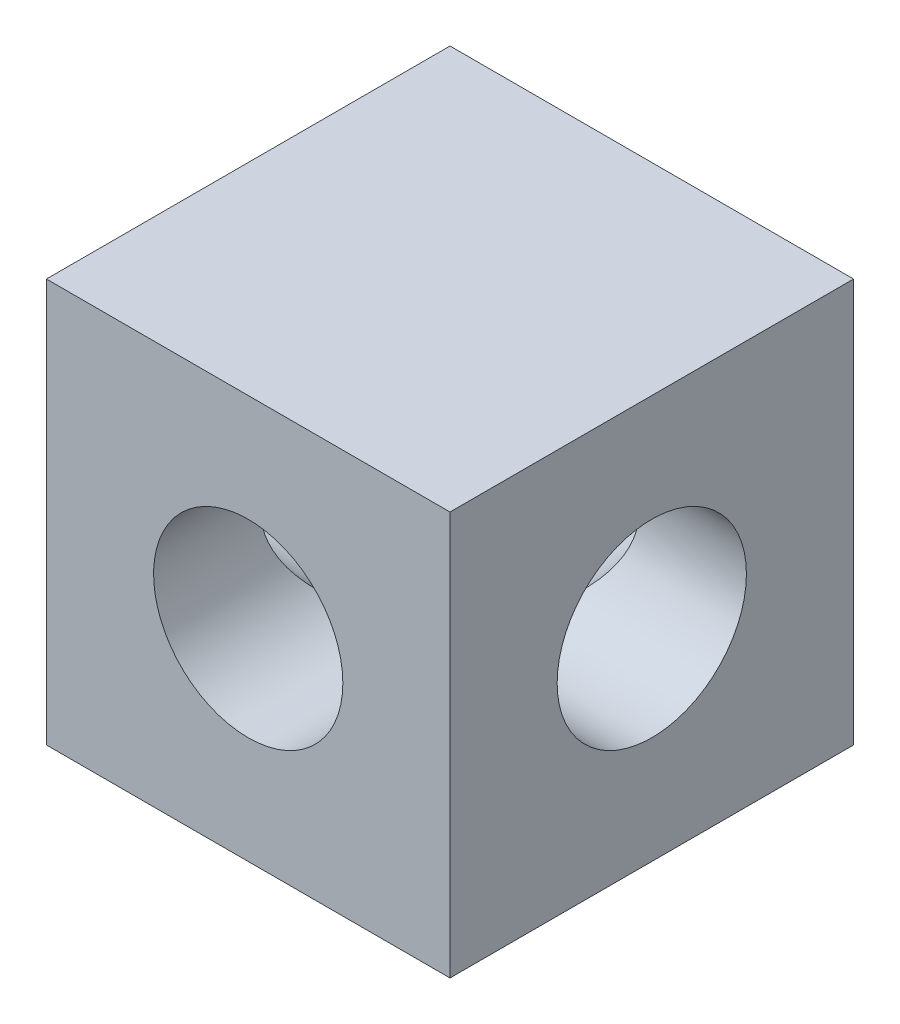
ISO-10303-21;
HEADER;
FILE_DESCRIPTION(('STEP AP214'),'2;1');
FILE_NAME('part.step','',(''),(''),'','','');
FILE_SCHEMA(('AUTOMOTIVE_DESIGN { 1 0 10303 214 1 1 1 1 }'));
ENDSEC;
DATA;
#1=APPLICATION_CONTEXT('core data for automotive mechanical design processes');
#2=APPLICATION_PROTOCOL_DEFINITION('international standard','automotive_design',2000,#1);
#3=PRODUCT_CONTEXT('',#1,'mechanical');
#4=PRODUCT('Part','Part','',(#3));
#5=PRODUCT_RELATED_PRODUCT_CATEGORY('part','',(#4));
#6=PRODUCT_DEFINITION_FORMATION('','',#4);
#7=PRODUCT_DEFINITION_CONTEXT('part definition',#1,'design');
#8=PRODUCT_DEFINITION('design','',#6,#7);
#9=PRODUCT_DEFINITION_SHAPE('','',#8);
#10=(LENGTH_UNIT() NAMED_UNIT(*) SI_UNIT(.MILLI.,.METRE.));
#11=(NAMED_UNIT(*) PLANE_ANGLE_UNIT() SI_UNIT($,.RADIAN.));
#12=(NAMED_UNIT(*) SI_UNIT($,.STERADIAN.) SOLID_ANGLE_UNIT());
#13=UNCERTAINTY_MEASURE_WITH_UNIT(LENGTH_MEASURE(1.E-05),#10,'distance_accuracy_value','');
#14=(GEOMETRIC_REPRESENTATION_CONTEXT(3) GLOBAL_UNCERTAINTY_ASSIGNED_CONTEXT((#13)) GLOBAL_UNIT_ASSIGNED_CONTEXT((#10,
#11,#12)) REPRESENTATION_CONTEXT('',''));
#15=CARTESIAN_POINT('',(0.,0.,0.));
#16=DIRECTION('',(0.,0.,1.));
#17=DIRECTION('',(1.,0.,0.));
#18=AXIS2_PLACEMENT_3D('',#15,#16,#17);
#19=CARTESIAN_POINT('',(0.,0.,20.32));
#20=DIRECTION('',(0.,0.,-1.));
#21=DIRECTION('',(-1.,0.,0.));
#22=AXIS2_PLACEMENT_3D('',#19,#20,#21);
#23=CYLINDRICAL_SURFACE('',#22,4.765);
#24=CARTESIAN_POINT('',(0.,0.,10.16));
#25=DIRECTION('',(0.707106781186547,0.,-0.707106781186547));
#26=DIRECTION('',(-0.707106781186547,0.,-0.707106781186547));
#27=AXIS2_PLACEMENT_3D('',#24,#25,#26);
#28=ELLIPSE('',#27,6.7387276247078,4.765);
#29=CARTESIAN_POINT('',(0.,-4.765,10.16));
#30=VERTEX_POINT('',#29);
#31=CARTESIAN_POINT('',(0.,4.765,10.16));
#32=VERTEX_POINT('',#31);
#33=EDGE_CURVE('E11',#30,#32,#28,.F.);
#34=ORIENTED_EDGE('',*,*,#33,.F.);
#35=CARTESIAN_POINT('',(0.,0.,10.16));
#36=DIRECTION('',(-0.707106781186547,0.,-0.707106781186547));
#37=DIRECTION('',(0.707106781186547,0.,-0.707106781186547));
#38=AXIS2_PLACEMENT_3D('',#35,#36,#37);
#39=ELLIPSE('',#38,6.7387276247078,4.765);
#40=EDGE_CURVE('E54',#32,#30,#39,.F.);
#41=ORIENTED_EDGE('',*,*,#40,.F.);
#42=EDGE_LOOP('',(#34,#41));
#43=FACE_BOUND('',#42,.T.);
#44=CARTESIAN_POINT('',(0.,0.,20.32));
#45=DIRECTION('',(0.,0.,1.));
#46=DIRECTION('',(1.,0.,0.));
#47=AXIS2_PLACEMENT_3D('',#44,#45,#46);
#48=CIRCLE('',#47,4.765);
#49=CARTESIAN_POINT('',(4.765,0.,20.32));
#50=VERTEX_POINT('',#49);
#51=EDGE_CURVE('E140',#50,#50,#48,.T.);
#52=ORIENTED_EDGE('',*,*,#51,.T.);
#53=EDGE_LOOP('',(#52));
#54=FACE_BOUND('',#53,.T.);
#55=ADVANCED_FACE('F39',(#43,#54),#23,.F.);
#56=CARTESIAN_POINT('',(0.,0.,20.32));
#57=DIRECTION('',(0.,0.,-1.));
#58=DIRECTION('',(-1.,0.,0.));
#59=AXIS2_PLACEMENT_3D('',#56,#57,#58);
#60=PLANE('',#59);
#61=DIRECTION('',(0.,1.,0.));
#62=VECTOR('',#61,1.);
#63=CARTESIAN_POINT('',(10.16,-10.16,20.32));
#64=LINE('',#63,#62);
#65=CARTESIAN_POINT('',(10.16,-10.16,20.32));
#66=VERTEX_POINT('',#65);
#67=CARTESIAN_POINT('',(10.16,10.16,20.32));
#68=VERTEX_POINT('',#67);
#69=EDGE_CURVE('E129',#66,#68,#64,.T.);
#70=ORIENTED_EDGE('',*,*,#69,.T.);
#71=DIRECTION('',(-1.,0.,0.));
#72=VECTOR('',#71,1.);
#73=CARTESIAN_POINT('',(-10.16,10.16,20.32));
#74=LINE('',#73,#72);
#75=CARTESIAN_POINT('',(-10.16,10.16,20.32));
#76=VERTEX_POINT('',#75);
#77=EDGE_CURVE('E92',#68,#76,#74,.T.);
#78=ORIENTED_EDGE('',*,*,#77,.T.);
#79=DIRECTION('',(0.,-1.,0.));
#80=VECTOR('',#79,1.);
#81=CARTESIAN_POINT('',(-10.16,-10.16,20.32));
#82=LINE('',#81,#80);
#83=CARTESIAN_POINT('',(-10.16,-10.16,20.32));
#84=VERTEX_POINT('',#83);
#85=EDGE_CURVE('E143',#76,#84,#82,.T.);
#86=ORIENTED_EDGE('',*,*,#85,.T.);
#87=DIRECTION('',(1.,0.,0.));
#88=VECTOR('',#87,1.);
#89=CARTESIAN_POINT('',(-10.16,-10.16,20.32));
#90=LINE('',#89,#88);
#91=EDGE_CURVE('E63',#84,#66,#90,.T.);
#92=ORIENTED_EDGE('',*,*,#91,.T.);
#93=EDGE_LOOP('',(#70,#78,#86,#92));
#94=FACE_BOUND('',#93,.T.);
#95=ORIENTED_EDGE('',*,*,#51,.F.);
#96=EDGE_LOOP('',(#95));
#97=FACE_BOUND('',#96,.T.);
#98=ADVANCED_FACE('F185',(#94,#97),#60,.F.);
#99=CARTESIAN_POINT('',(0.,0.,0.));
#100=DIRECTION('',(0.,0.,-1.));
#101=DIRECTION('',(-1.,0.,0.));
#102=AXIS2_PLACEMENT_3D('',#99,#100,#101);
#103=PLANE('',#102);
#104=DIRECTION('',(0.,1.,0.));
#105=VECTOR('',#104,1.);
#106=CARTESIAN_POINT('',(10.16,-10.16,0.));
#107=LINE('',#106,#105);
#108=CARTESIAN_POINT('',(10.16,-10.16,0.));
#109=VERTEX_POINT('',#108);
#110=CARTESIAN_POINT('',(10.16,10.16,0.));
#111=VERTEX_POINT('',#110);
#112=EDGE_CURVE('E136',#109,#111,#107,.T.);
#113=ORIENTED_EDGE('',*,*,#112,.F.);
#114=DIRECTION('',(1.,0.,0.));
#115=VECTOR('',#114,1.);
#116=CARTESIAN_POINT('',(-10.16,-10.16,0.));
#117=LINE('',#116,#115);
#118=CARTESIAN_POINT('',(-10.16,-10.16,0.));
#119=VERTEX_POINT('',#118);
#120=EDGE_CURVE('E84',#119,#109,#117,.T.);
#121=ORIENTED_EDGE('',*,*,#120,.F.);
#122=DIRECTION('',(0.,-1.,0.));
#123=VECTOR('',#122,1.);
#124=CARTESIAN_POINT('',(-10.16,-10.16,0.));
#125=LINE('',#124,#123);
#126=CARTESIAN_POINT('',(-10.16,10.16,0.));
#127=VERTEX_POINT('',#126);
#128=EDGE_CURVE('E130',#127,#119,#125,.T.);
#129=ORIENTED_EDGE('',*,*,#128,.F.);
#130=DIRECTION('',(-1.,0.,0.));
#131=VECTOR('',#130,1.);
#132=CARTESIAN_POINT('',(-10.16,10.16,0.));
#133=LINE('',#132,#131);
#134=EDGE_CURVE('E133',#111,#127,#133,.T.);
#135=ORIENTED_EDGE('',*,*,#134,.F.);
#136=EDGE_LOOP('',(#113,#121,#129,#135));
#137=FACE_BOUND('',#136,.T.);
#138=CARTESIAN_POINT('',(0.,0.,0.));
#139=DIRECTION('',(0.,0.,1.));
#140=DIRECTION('',(1.,0.,0.));
#141=AXIS2_PLACEMENT_3D('',#138,#139,#140);
#142=CIRCLE('',#141,4.765);
#143=CARTESIAN_POINT('',(4.765,0.,0.));
#144=VERTEX_POINT('',#143);
#145=EDGE_CURVE('E150',#144,#144,#142,.T.);
#146=ORIENTED_EDGE('',*,*,#145,.T.);
#147=EDGE_LOOP('',(#146));
#148=FACE_BOUND('',#147,.T.);
#149=ADVANCED_FACE('F169',(#137,#148),#103,.T.);
#150=CARTESIAN_POINT('',(10.16,-10.16,20.32));
#151=DIRECTION('',(-1.,0.,0.));
#152=DIRECTION('',(0.,0.,1.));
#153=AXIS2_PLACEMENT_3D('',#150,#151,#152);
#154=PLANE('',#153);
#155=CARTESIAN_POINT('',(10.16,0.,10.16));
#156=DIRECTION('',(1.,0.,0.));
#157=DIRECTION('',(0.,0.,-1.));
#158=AXIS2_PLACEMENT_3D('',#155,#156,#157);
#159=CIRCLE('',#158,4.765);
#160=CARTESIAN_POINT('',(10.16,0.,5.395));
#161=VERTEX_POINT('',#160);
#162=EDGE_CURVE('E161',#161,#161,#159,.T.);
#163=ORIENTED_EDGE('',*,*,#162,.F.);
#164=EDGE_LOOP('',(#163));
#165=FACE_BOUND('',#164,.T.);
#166=ORIENTED_EDGE('',*,*,#112,.T.);
#167=DIRECTION('',(0.,0.,-1.));
#168=VECTOR('',#167,1.);
#169=CARTESIAN_POINT('',(10.16,10.16,20.32));
#170=LINE('',#169,#168);
#171=EDGE_CURVE('E108',#68,#111,#170,.T.);
#172=ORIENTED_EDGE('',*,*,#171,.F.);
#173=ORIENTED_EDGE('',*,*,#69,.F.);
#174=DIRECTION('',(0.,0.,-1.));
#175=VECTOR('',#174,1.);
#176=CARTESIAN_POINT('',(10.16,-10.16,20.32));
#177=LINE('',#176,#175);
#178=EDGE_CURVE('E124',#66,#109,#177,.T.);
#179=ORIENTED_EDGE('',*,*,#178,.T.);
#180=EDGE_LOOP('',(#166,#172,#173,#179));
#181=FACE_BOUND('',#180,.T.);
#182=ADVANCED_FACE('F41',(#165,#181),#154,.F.);
#183=CARTESIAN_POINT('',(-10.16,10.16,20.32));
#184=DIRECTION('',(0.,-1.,0.));
#185=DIRECTION('',(0.,0.,-1.));
#186=AXIS2_PLACEMENT_3D('',#183,#184,#185);
#187=PLANE('',#186);
#188=ORIENTED_EDGE('',*,*,#134,.T.);
#189=DIRECTION('',(0.,0.,-1.));
#190=VECTOR('',#189,1.);
#191=CARTESIAN_POINT('',(-10.16,10.16,20.32));
#192=LINE('',#191,#190);
#193=EDGE_CURVE('E117',#76,#127,#192,.T.);
#194=ORIENTED_EDGE('',*,*,#193,.F.);
#195=ORIENTED_EDGE('',*,*,#77,.F.);
#196=ORIENTED_EDGE('',*,*,#171,.T.);
#197=EDGE_LOOP('',(#188,#194,#195,#196));
#198=FACE_BOUND('',#197,.T.);
#199=ADVANCED_FACE('F168',(#198),#187,.F.);
#200=CARTESIAN_POINT('',(-10.16,-10.16,20.32));
#201=DIRECTION('',(1.,0.,0.));
#202=DIRECTION('',(0.,0.,-1.));
#203=AXIS2_PLACEMENT_3D('',#200,#201,#202);
#204=PLANE('',#203);
#205=CARTESIAN_POINT('',(-10.16,0.,10.16));
#206=DIRECTION('',(1.,0.,0.));
#207=DIRECTION('',(0.,0.,-1.));
#208=AXIS2_PLACEMENT_3D('',#205,#206,#207);
#209=CIRCLE('',#208,4.765);
#210=CARTESIAN_POINT('',(-10.16,0.,5.395));
#211=VERTEX_POINT('',#210);
#212=EDGE_CURVE('E154',#211,#211,#209,.T.);
#213=ORIENTED_EDGE('',*,*,#212,.T.);
#214=EDGE_LOOP('',(#213));
#215=FACE_BOUND('',#214,.T.);
#216=ORIENTED_EDGE('',*,*,#128,.T.);
#217=DIRECTION('',(0.,0.,-1.));
#218=VECTOR('',#217,1.);
#219=CARTESIAN_POINT('',(-10.16,-10.16,20.32));
#220=LINE('',#219,#218);
#221=EDGE_CURVE('E121',#84,#119,#220,.T.);
#222=ORIENTED_EDGE('',*,*,#221,.F.);
#223=ORIENTED_EDGE('',*,*,#85,.F.);
#224=ORIENTED_EDGE('',*,*,#193,.T.);
#225=EDGE_LOOP('',(#216,#222,#223,#224));
#226=FACE_BOUND('',#225,.T.);
#227=ADVANCED_FACE('F177',(#215,#226),#204,.F.);
#228=CARTESIAN_POINT('',(-10.16,-10.16,20.32));
#229=DIRECTION('',(0.,1.,0.));
#230=DIRECTION('',(0.,0.,1.));
#231=AXIS2_PLACEMENT_3D('',#228,#229,#230);
#232=PLANE('',#231);
#233=ORIENTED_EDGE('',*,*,#120,.T.);
#234=ORIENTED_EDGE('',*,*,#178,.F.);
#235=ORIENTED_EDGE('',*,*,#91,.F.);
#236=ORIENTED_EDGE('',*,*,#221,.T.);
#237=EDGE_LOOP('',(#233,#234,#235,#236));
#238=FACE_BOUND('',#237,.T.);
#239=ADVANCED_FACE('F181',(#238),#232,.F.);
#240=CARTESIAN_POINT('',(0.,0.,10.16));
#241=DIRECTION('',(0.707106781186547,0.,-0.707106781186547));
#242=DIRECTION('',(-0.707106781186547,0.,-0.707106781186547));
#243=AXIS2_PLACEMENT_3D('',#240,#241,#242);
#244=ELLIPSE('',#243,6.7387276247078,4.765);
#245=EDGE_CURVE('E48',#30,#32,#244,.T.);
#246=ORIENTED_EDGE('',*,*,#245,.F.);
#247=CARTESIAN_POINT('',(0.,0.,10.16));
#248=DIRECTION('',(-0.707106781186547,0.,-0.707106781186547));
#249=DIRECTION('',(0.707106781186547,0.,-0.707106781186547));
#250=AXIS2_PLACEMENT_3D('',#247,#248,#249);
#251=ELLIPSE('',#250,6.7387276247078,4.765);
#252=EDGE_CURVE('E97',#32,#30,#251,.T.);
#253=ORIENTED_EDGE('',*,*,#252,.F.);
#254=EDGE_LOOP('',(#246,#253));
#255=FACE_BOUND('',#254,.T.);
#256=ORIENTED_EDGE('',*,*,#145,.F.);
#257=EDGE_LOOP('',(#256));
#258=FACE_BOUND('',#257,.T.);
#259=ADVANCED_FACE('F111',(#255,#258),#23,.F.);
#260=CARTESIAN_POINT('',(-10.16,0.,10.16));
#261=DIRECTION('',(1.,0.,0.));
#262=DIRECTION('',(0.,0.,-1.));
#263=AXIS2_PLACEMENT_3D('',#260,#261,#262);
#264=CYLINDRICAL_SURFACE('',#263,4.765);
#265=ORIENTED_EDGE('',*,*,#245,.T.);
#266=ORIENTED_EDGE('',*,*,#40,.T.);
#267=EDGE_LOOP('',(#265,#266));
#268=FACE_BOUND('',#267,.T.);
#269=ORIENTED_EDGE('',*,*,#212,.F.);
#270=EDGE_LOOP('',(#269));
#271=FACE_BOUND('',#270,.T.);
#272=ADVANCED_FACE('F105',(#268,#271),#264,.F.);
#273=ORIENTED_EDGE('',*,*,#33,.T.);
#274=ORIENTED_EDGE('',*,*,#252,.T.);
#275=EDGE_LOOP('',(#273,#274));
#276=FACE_BOUND('',#275,.T.);
#277=ORIENTED_EDGE('',*,*,#162,.T.);
#278=EDGE_LOOP('',(#277));
#279=FACE_BOUND('',#278,.T.);
#280=ADVANCED_FACE('F98',(#276,#279),#264,.F.);
#281=CLOSED_SHELL('',(#55,#98,#149,#182,#199,#227,#239,#259,#272,#280));
#282=MANIFOLD_SOLID_BREP('B2',#281);
#283=ADVANCED_BREP_SHAPE_REPRESENTATION('',(#18,#282),#14);
#284=SHAPE_DEFINITION_REPRESENTATION(#9,#283);
ENDSEC;
END-ISO-10303-21;
